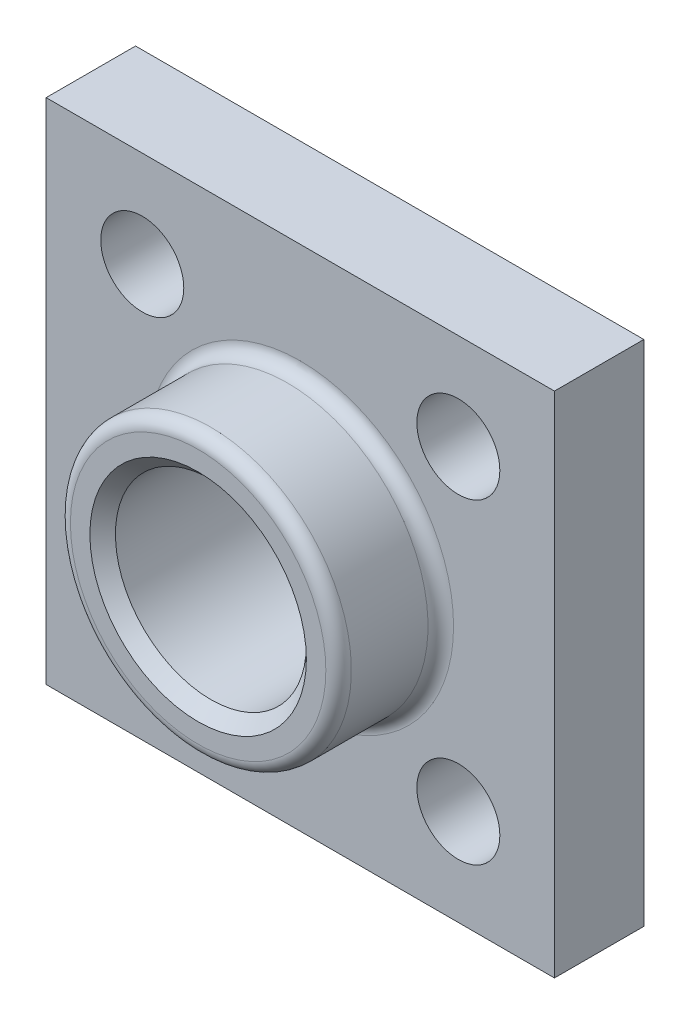
ISO-10303-21;
HEADER;
FILE_DESCRIPTION(('STEP AP214'),'2;1');
FILE_NAME('part.step','',(''),(''),'','','');
FILE_SCHEMA(('AUTOMOTIVE_DESIGN { 1 0 10303 214 1 1 1 1 }'));
ENDSEC;
DATA;
#1=APPLICATION_CONTEXT('core data for automotive mechanical design processes');
#2=APPLICATION_PROTOCOL_DEFINITION('international standard','automotive_design',2000,#1);
#3=PRODUCT_CONTEXT('',#1,'mechanical');
#4=PRODUCT('Part','Part','',(#3));
#5=PRODUCT_RELATED_PRODUCT_CATEGORY('part','',(#4));
#6=PRODUCT_DEFINITION_FORMATION('','',#4);
#7=PRODUCT_DEFINITION_CONTEXT('part definition',#1,'design');
#8=PRODUCT_DEFINITION('design','',#6,#7);
#9=PRODUCT_DEFINITION_SHAPE('','',#8);
#10=(LENGTH_UNIT() NAMED_UNIT(*) SI_UNIT(.MILLI.,.METRE.));
#11=(NAMED_UNIT(*) PLANE_ANGLE_UNIT() SI_UNIT($,.RADIAN.));
#12=(NAMED_UNIT(*) SI_UNIT($,.STERADIAN.) SOLID_ANGLE_UNIT());
#13=UNCERTAINTY_MEASURE_WITH_UNIT(LENGTH_MEASURE(1.E-05),#10,'distance_accuracy_value','');
#14=(GEOMETRIC_REPRESENTATION_CONTEXT(3) GLOBAL_UNCERTAINTY_ASSIGNED_CONTEXT((#13)) GLOBAL_UNIT_ASSIGNED_CONTEXT((#10,
#11,#12)) REPRESENTATION_CONTEXT('',''));
#15=CARTESIAN_POINT('',(0.,0.,0.));
#16=DIRECTION('',(0.,0.,1.));
#17=DIRECTION('',(1.,0.,0.));
#18=AXIS2_PLACEMENT_3D('',#15,#16,#17);
#19=CARTESIAN_POINT('',(19.9,-19.9,15.));
#20=DIRECTION('',(0.,0.,1.));
#21=DIRECTION('',(1.,0.,0.));
#22=AXIS2_PLACEMENT_3D('',#19,#20,#21);
#23=PLANE('',#22);
#24=CARTESIAN_POINT('',(19.9,-19.9,15.));
#25=DIRECTION('',(0.,0.,1.));
#26=DIRECTION('',(0.,-1.,0.));
#27=AXIS2_PLACEMENT_3D('',#24,#25,#26);
#28=CIRCLE('',#27,8.475);
#29=CARTESIAN_POINT('',(19.9,-28.375,15.));
#30=VERTEX_POINT('',#29);
#31=EDGE_CURVE('E74',#30,#30,#28,.T.);
#32=ORIENTED_EDGE('',*,*,#31,.F.);
#33=EDGE_LOOP('',(#32));
#34=FACE_BOUND('',#33,.T.);
#35=CARTESIAN_POINT('',(19.9,-19.9,15.));
#36=DIRECTION('',(0.,0.,-1.));
#37=DIRECTION('',(1.,0.,0.));
#38=AXIS2_PLACEMENT_3D('',#35,#36,#37);
#39=CIRCLE('',#38,10.);
#40=CARTESIAN_POINT('',(29.9,-19.9,15.));
#41=VERTEX_POINT('',#40);
#42=CARTESIAN_POINT('',(9.9,-19.9,15.));
#43=VERTEX_POINT('',#42);
#44=EDGE_CURVE('E68',#41,#43,#39,.T.);
#45=ORIENTED_EDGE('',*,*,#44,.F.);
#46=CARTESIAN_POINT('',(19.9,-19.9,15.));
#47=DIRECTION('',(0.,0.,-1.));
#48=DIRECTION('',(-1.,0.,0.));
#49=AXIS2_PLACEMENT_3D('',#46,#47,#48);
#50=CIRCLE('',#49,10.);
#51=EDGE_CURVE('E64',#43,#41,#50,.T.);
#52=ORIENTED_EDGE('',*,*,#51,.F.);
#53=EDGE_LOOP('',(#45,#52));
#54=FACE_BOUND('',#53,.T.);
#55=ADVANCED_FACE('F17',(#34,#54),#23,.T.);
#56=CARTESIAN_POINT('',(19.9,-19.9,14.));
#57=DIRECTION('',(0.,0.,-1.));
#58=DIRECTION('',(-1.,0.,0.));
#59=AXIS2_PLACEMENT_3D('',#56,#57,#58);
#60=TOROIDAL_SURFACE('',#59,10.,1.);
#61=CARTESIAN_POINT('',(19.9,-19.9,14.));
#62=DIRECTION('',(0.,0.,1.));
#63=DIRECTION('',(-1.,0.,0.));
#64=AXIS2_PLACEMENT_3D('',#61,#62,#63);
#65=CIRCLE('',#64,11.);
#66=CARTESIAN_POINT('',(8.9,-19.9,14.));
#67=VERTEX_POINT('',#66);
#68=EDGE_CURVE('E102',#67,#67,#65,.F.);
#69=ORIENTED_EDGE('',*,*,#68,.F.);
#70=EDGE_LOOP('',(#69));
#71=FACE_BOUND('',#70,.T.);
#72=ORIENTED_EDGE('',*,*,#44,.T.);
#73=ORIENTED_EDGE('',*,*,#51,.T.);
#74=EDGE_LOOP('',(#72,#73));
#75=FACE_BOUND('',#74,.T.);
#76=ADVANCED_FACE('F73',(#71,#75),#60,.T.);
#77=CARTESIAN_POINT('',(19.9,-19.9,14.));
#78=DIRECTION('',(0.,0.,1.));
#79=DIRECTION('',(0.,-1.,0.));
#80=AXIS2_PLACEMENT_3D('',#77,#78,#79);
#81=CONICAL_SURFACE('',#80,7.475,0.785398163397451);
#82=ORIENTED_EDGE('',*,*,#31,.T.);
#83=EDGE_LOOP('',(#82));
#84=FACE_BOUND('',#83,.T.);
#85=CARTESIAN_POINT('',(19.9,-19.9,14.));
#86=DIRECTION('',(0.,0.,1.));
#87=DIRECTION('',(1.,0.,0.));
#88=AXIS2_PLACEMENT_3D('',#85,#86,#87);
#89=CIRCLE('',#88,7.475);
#90=CARTESIAN_POINT('',(27.375,-19.9,14.));
#91=VERTEX_POINT('',#90);
#92=EDGE_CURVE('E100',#91,#91,#89,.T.);
#93=ORIENTED_EDGE('',*,*,#92,.F.);
#94=EDGE_LOOP('',(#93));
#95=FACE_BOUND('',#94,.T.);
#96=ADVANCED_FACE('F91',(#84,#95),#81,.F.);
#97=CARTESIAN_POINT('',(19.9,-19.9,8.));
#98=DIRECTION('',(0.,0.,1.));
#99=DIRECTION('',(1.,0.,0.));
#100=AXIS2_PLACEMENT_3D('',#97,#98,#99);
#101=CYLINDRICAL_SURFACE('',#100,11.);
#102=CARTESIAN_POINT('',(19.9,-19.9,8.));
#103=DIRECTION('',(0.,0.,-1.));
#104=DIRECTION('',(-1.,0.,0.));
#105=AXIS2_PLACEMENT_3D('',#102,#103,#104);
#106=CIRCLE('',#105,11.);
#107=CARTESIAN_POINT('',(8.89999999999999,-19.9,8.));
#108=VERTEX_POINT('',#107);
#109=EDGE_CURVE('E114',#108,#108,#106,.T.);
#110=ORIENTED_EDGE('',*,*,#109,.F.);
#111=EDGE_LOOP('',(#110));
#112=FACE_BOUND('',#111,.T.);
#113=ORIENTED_EDGE('',*,*,#68,.T.);
#114=EDGE_LOOP('',(#113));
#115=FACE_BOUND('',#114,.T.);
#116=ADVANCED_FACE('F190',(#112,#115),#101,.T.);
#117=CARTESIAN_POINT('',(19.9,-19.9,1.));
#118=DIRECTION('',(0.,0.,1.));
#119=DIRECTION('',(1.,0.,0.));
#120=AXIS2_PLACEMENT_3D('',#117,#118,#119);
#121=CYLINDRICAL_SURFACE('',#120,7.475);
#122=CARTESIAN_POINT('',(19.9,-19.9,0.999999999999996));
#123=DIRECTION('',(0.,0.,-1.));
#124=DIRECTION('',(1.,0.,0.));
#125=AXIS2_PLACEMENT_3D('',#122,#123,#124);
#126=CIRCLE('',#125,7.475);
#127=CARTESIAN_POINT('',(27.375,-19.9,0.999999999999996));
#128=VERTEX_POINT('',#127);
#129=EDGE_CURVE('E175',#128,#128,#126,.F.);
#130=ORIENTED_EDGE('',*,*,#129,.F.);
#131=EDGE_LOOP('',(#130));
#132=FACE_BOUND('',#131,.T.);
#133=ORIENTED_EDGE('',*,*,#92,.T.);
#134=EDGE_LOOP('',(#133));
#135=FACE_BOUND('',#134,.T.);
#136=ADVANCED_FACE('F192',(#132,#135),#121,.F.);
#137=CARTESIAN_POINT('',(19.9,-19.9,8.));
#138=DIRECTION('',(0.,0.,-1.));
#139=DIRECTION('',(-1.,0.,0.));
#140=AXIS2_PLACEMENT_3D('',#137,#138,#139);
#141=TOROIDAL_SURFACE('',#140,12.,1.);
#142=CARTESIAN_POINT('',(19.9,-19.9,7.));
#143=DIRECTION('',(0.,0.,-1.));
#144=DIRECTION('',(-1.,0.,0.));
#145=AXIS2_PLACEMENT_3D('',#142,#143,#144);
#146=CIRCLE('',#145,12.);
#147=CARTESIAN_POINT('',(7.9,-19.9,7.));
#148=VERTEX_POINT('',#147);
#149=EDGE_CURVE('E130',#148,#148,#146,.T.);
#150=ORIENTED_EDGE('',*,*,#149,.F.);
#151=EDGE_LOOP('',(#150));
#152=FACE_BOUND('',#151,.T.);
#153=ORIENTED_EDGE('',*,*,#109,.T.);
#154=EDGE_LOOP('',(#153));
#155=FACE_BOUND('',#154,.T.);
#156=ADVANCED_FACE('F188',(#152,#155),#141,.F.);
#157=CARTESIAN_POINT('',(0.,0.,0.));
#158=DIRECTION('',(0.,1.,0.));
#159=DIRECTION('',(0.,0.,1.));
#160=AXIS2_PLACEMENT_3D('',#157,#158,#159);
#161=PLANE('',#160);
#162=DIRECTION('',(-1.,0.,0.));
#163=VECTOR('',#162,1.);
#164=CARTESIAN_POINT('',(19.9,0.,0.));
#165=LINE('',#164,#163);
#166=CARTESIAN_POINT('',(0.,0.,0.));
#167=VERTEX_POINT('',#166);
#168=CARTESIAN_POINT('',(39.8,0.,0.));
#169=VERTEX_POINT('',#168);
#170=EDGE_CURVE('E133',#167,#169,#165,.F.);
#171=ORIENTED_EDGE('',*,*,#170,.F.);
#172=DIRECTION('',(0.,0.,1.));
#173=VECTOR('',#172,1.);
#174=CARTESIAN_POINT('',(0.,0.,0.));
#175=LINE('',#174,#173);
#176=CARTESIAN_POINT('',(0.,0.,7.));
#177=VERTEX_POINT('',#176);
#178=EDGE_CURVE('E177',#177,#167,#175,.F.);
#179=ORIENTED_EDGE('',*,*,#178,.F.);
#180=DIRECTION('',(1.,0.,0.));
#181=VECTOR('',#180,1.);
#182=CARTESIAN_POINT('',(19.9,0.,7.));
#183=LINE('',#182,#181);
#184=CARTESIAN_POINT('',(39.8,0.,7.));
#185=VERTEX_POINT('',#184);
#186=EDGE_CURVE('E165',#185,#177,#183,.F.);
#187=ORIENTED_EDGE('',*,*,#186,.F.);
#188=DIRECTION('',(0.,0.,-1.));
#189=VECTOR('',#188,1.);
#190=CARTESIAN_POINT('',(39.8,0.,0.));
#191=LINE('',#190,#189);
#192=EDGE_CURVE('E182',#169,#185,#191,.F.);
#193=ORIENTED_EDGE('',*,*,#192,.F.);
#194=EDGE_LOOP('',(#171,#179,#187,#193));
#195=FACE_BOUND('',#194,.T.);
#196=ADVANCED_FACE('F223',(#195),#161,.T.);
#197=CARTESIAN_POINT('',(39.8,0.,0.));
#198=DIRECTION('',(1.,0.,0.));
#199=DIRECTION('',(0.,0.,-1.));
#200=AXIS2_PLACEMENT_3D('',#197,#198,#199);
#201=PLANE('',#200);
#202=DIRECTION('',(0.,1.,0.));
#203=VECTOR('',#202,1.);
#204=CARTESIAN_POINT('',(39.8,-19.9,0.));
#205=LINE('',#204,#203);
#206=CARTESIAN_POINT('',(39.8,-39.8,0.));
#207=VERTEX_POINT('',#206);
#208=EDGE_CURVE('E237',#169,#207,#205,.F.);
#209=ORIENTED_EDGE('',*,*,#208,.F.);
#210=ORIENTED_EDGE('',*,*,#192,.T.);
#211=DIRECTION('',(0.,1.,0.));
#212=VECTOR('',#211,1.);
#213=CARTESIAN_POINT('',(39.8,-19.9,7.));
#214=LINE('',#213,#212);
#215=CARTESIAN_POINT('',(39.8,-39.8,7.));
#216=VERTEX_POINT('',#215);
#217=EDGE_CURVE('E170',#216,#185,#214,.T.);
#218=ORIENTED_EDGE('',*,*,#217,.F.);
#219=DIRECTION('',(0.,0.,-1.));
#220=VECTOR('',#219,1.);
#221=CARTESIAN_POINT('',(39.8,-39.8,0.));
#222=LINE('',#221,#220);
#223=EDGE_CURVE('E179',#207,#216,#222,.F.);
#224=ORIENTED_EDGE('',*,*,#223,.F.);
#225=EDGE_LOOP('',(#209,#210,#218,#224));
#226=FACE_BOUND('',#225,.T.);
#227=ADVANCED_FACE('F221',(#226),#201,.T.);
#228=CARTESIAN_POINT('',(39.8,-39.8,0.));
#229=DIRECTION('',(0.,-1.,0.));
#230=DIRECTION('',(0.,0.,-1.));
#231=AXIS2_PLACEMENT_3D('',#228,#229,#230);
#232=PLANE('',#231);
#233=DIRECTION('',(-1.,0.,0.));
#234=VECTOR('',#233,1.);
#235=CARTESIAN_POINT('',(19.9,-39.8,0.));
#236=LINE('',#235,#234);
#237=CARTESIAN_POINT('',(0.,-39.8,0.));
#238=VERTEX_POINT('',#237);
#239=EDGE_CURVE('E239',#207,#238,#236,.T.);
#240=ORIENTED_EDGE('',*,*,#239,.F.);
#241=ORIENTED_EDGE('',*,*,#223,.T.);
#242=DIRECTION('',(1.,0.,0.));
#243=VECTOR('',#242,1.);
#244=CARTESIAN_POINT('',(19.9,-39.8,7.));
#245=LINE('',#244,#243);
#246=CARTESIAN_POINT('',(0.,-39.8,7.));
#247=VERTEX_POINT('',#246);
#248=EDGE_CURVE('E124',#247,#216,#245,.T.);
#249=ORIENTED_EDGE('',*,*,#248,.F.);
#250=DIRECTION('',(0.,0.,1.));
#251=VECTOR('',#250,1.);
#252=CARTESIAN_POINT('',(0.,-39.8,0.));
#253=LINE('',#252,#251);
#254=EDGE_CURVE('E38',#238,#247,#253,.T.);
#255=ORIENTED_EDGE('',*,*,#254,.F.);
#256=EDGE_LOOP('',(#240,#241,#249,#255));
#257=FACE_BOUND('',#256,.T.);
#258=ADVANCED_FACE('F218',(#257),#232,.T.);
#259=CARTESIAN_POINT('',(0.,-39.8,0.));
#260=DIRECTION('',(-1.,0.,0.));
#261=DIRECTION('',(0.,0.,1.));
#262=AXIS2_PLACEMENT_3D('',#259,#260,#261);
#263=PLANE('',#262);
#264=DIRECTION('',(0.,1.,0.));
#265=VECTOR('',#264,1.);
#266=CARTESIAN_POINT('',(0.,-19.9,0.));
#267=LINE('',#266,#265);
#268=EDGE_CURVE('E138',#238,#167,#267,.T.);
#269=ORIENTED_EDGE('',*,*,#268,.F.);
#270=ORIENTED_EDGE('',*,*,#254,.T.);
#271=DIRECTION('',(0.,1.,0.));
#272=VECTOR('',#271,1.);
#273=CARTESIAN_POINT('',(0.,-19.9,7.));
#274=LINE('',#273,#272);
#275=EDGE_CURVE('E162',#177,#247,#274,.F.);
#276=ORIENTED_EDGE('',*,*,#275,.F.);
#277=ORIENTED_EDGE('',*,*,#178,.T.);
#278=EDGE_LOOP('',(#269,#270,#276,#277));
#279=FACE_BOUND('',#278,.T.);
#280=ADVANCED_FACE('F214',(#279),#263,.T.);
#281=CARTESIAN_POINT('',(32.2743686707646,-7.52563132923542,0.));
#282=DIRECTION('',(0.,0.,1.));
#283=DIRECTION('',(1.,0.,0.));
#284=AXIS2_PLACEMENT_3D('',#281,#282,#283);
#285=CYLINDRICAL_SURFACE('',#284,3.24999999999999);
#286=CARTESIAN_POINT('',(32.2743686707646,-7.52563132923542,7.));
#287=DIRECTION('',(0.,0.,1.));
#288=DIRECTION('',(1.,0.,0.));
#289=AXIS2_PLACEMENT_3D('',#286,#287,#288);
#290=CIRCLE('',#289,3.24999999999999);
#291=CARTESIAN_POINT('',(35.5243686707646,-7.52563132923542,7.));
#292=VERTEX_POINT('',#291);
#293=EDGE_CURVE('E120',#292,#292,#290,.F.);
#294=ORIENTED_EDGE('',*,*,#293,.F.);
#295=EDGE_LOOP('',(#294));
#296=FACE_BOUND('',#295,.T.);
#297=CARTESIAN_POINT('',(32.2743686707646,-7.52563132923542,0.));
#298=DIRECTION('',(0.,0.,1.));
#299=DIRECTION('',(1.,0.,0.));
#300=AXIS2_PLACEMENT_3D('',#297,#298,#299);
#301=CIRCLE('',#300,3.24999999999999);
#302=CARTESIAN_POINT('',(35.5243686707646,-7.52563132923542,0.));
#303=VERTEX_POINT('',#302);
#304=EDGE_CURVE('E134',#303,#303,#301,.T.);
#305=ORIENTED_EDGE('',*,*,#304,.F.);
#306=EDGE_LOOP('',(#305));
#307=FACE_BOUND('',#306,.T.);
#308=ADVANCED_FACE('F217',(#296,#307),#285,.F.);
#309=CARTESIAN_POINT('',(32.2743686707646,-32.2743686707646,0.));
#310=DIRECTION('',(0.,0.,1.));
#311=DIRECTION('',(1.,0.,0.));
#312=AXIS2_PLACEMENT_3D('',#309,#310,#311);
#313=CYLINDRICAL_SURFACE('',#312,3.25);
#314=CARTESIAN_POINT('',(32.2743686707646,-32.2743686707646,7.));
#315=DIRECTION('',(0.,0.,1.));
#316=DIRECTION('',(1.,0.,0.));
#317=AXIS2_PLACEMENT_3D('',#314,#315,#316);
#318=CIRCLE('',#317,3.25);
#319=CARTESIAN_POINT('',(35.5243686707646,-32.2743686707646,7.));
#320=VERTEX_POINT('',#319);
#321=EDGE_CURVE('E123',#320,#320,#318,.F.);
#322=ORIENTED_EDGE('',*,*,#321,.F.);
#323=EDGE_LOOP('',(#322));
#324=FACE_BOUND('',#323,.T.);
#325=CARTESIAN_POINT('',(32.2743686707646,-32.2743686707646,0.));
#326=DIRECTION('',(0.,0.,1.));
#327=DIRECTION('',(1.,0.,0.));
#328=AXIS2_PLACEMENT_3D('',#325,#326,#327);
#329=CIRCLE('',#328,3.25);
#330=CARTESIAN_POINT('',(35.5243686707646,-32.2743686707646,0.));
#331=VERTEX_POINT('',#330);
#332=EDGE_CURVE('E137',#331,#331,#329,.T.);
#333=ORIENTED_EDGE('',*,*,#332,.F.);
#334=EDGE_LOOP('',(#333));
#335=FACE_BOUND('',#334,.T.);
#336=ADVANCED_FACE('F249',(#324,#335),#313,.F.);
#337=CARTESIAN_POINT('',(7.52563132923542,-32.2743686707646,0.));
#338=DIRECTION('',(0.,0.,1.));
#339=DIRECTION('',(1.,0.,0.));
#340=AXIS2_PLACEMENT_3D('',#337,#338,#339);
#341=CYLINDRICAL_SURFACE('',#340,3.25);
#342=CARTESIAN_POINT('',(7.52563132923542,-32.2743686707646,7.));
#343=DIRECTION('',(0.,0.,1.));
#344=DIRECTION('',(1.,0.,0.));
#345=AXIS2_PLACEMENT_3D('',#342,#343,#344);
#346=CIRCLE('',#345,3.25);
#347=CARTESIAN_POINT('',(10.7756313292354,-32.2743686707646,7.));
#348=VERTEX_POINT('',#347);
#349=EDGE_CURVE('E127',#348,#348,#346,.F.);
#350=ORIENTED_EDGE('',*,*,#349,.F.);
#351=EDGE_LOOP('',(#350));
#352=FACE_BOUND('',#351,.T.);
#353=CARTESIAN_POINT('',(7.52563132923542,-32.2743686707646,0.));
#354=DIRECTION('',(0.,0.,1.));
#355=DIRECTION('',(1.,0.,0.));
#356=AXIS2_PLACEMENT_3D('',#353,#354,#355);
#357=CIRCLE('',#356,3.25);
#358=CARTESIAN_POINT('',(10.7756313292354,-32.2743686707646,0.));
#359=VERTEX_POINT('',#358);
#360=EDGE_CURVE('E141',#359,#359,#357,.T.);
#361=ORIENTED_EDGE('',*,*,#360,.F.);
#362=EDGE_LOOP('',(#361));
#363=FACE_BOUND('',#362,.T.);
#364=ADVANCED_FACE('F212',(#352,#363),#341,.F.);
#365=CARTESIAN_POINT('',(19.9,-19.9,0.999999999999996));
#366=DIRECTION('',(0.,0.,-1.));
#367=DIRECTION('',(-1.,0.,0.));
#368=AXIS2_PLACEMENT_3D('',#365,#366,#367);
#369=CONICAL_SURFACE('',#368,7.475,0.785398163397451);
#370=CARTESIAN_POINT('',(19.9,-19.9,0.));
#371=DIRECTION('',(0.,0.,-1.));
#372=DIRECTION('',(-1.,0.,0.));
#373=AXIS2_PLACEMENT_3D('',#370,#371,#372);
#374=CIRCLE('',#373,8.475);
#375=CARTESIAN_POINT('',(11.425,-19.9,0.));
#376=VERTEX_POINT('',#375);
#377=EDGE_CURVE('E144',#376,#376,#374,.F.);
#378=ORIENTED_EDGE('',*,*,#377,.F.);
#379=EDGE_LOOP('',(#378));
#380=FACE_BOUND('',#379,.T.);
#381=ORIENTED_EDGE('',*,*,#129,.T.);
#382=EDGE_LOOP('',(#381));
#383=FACE_BOUND('',#382,.T.);
#384=ADVANCED_FACE('F155',(#380,#383),#369,.F.);
#385=CARTESIAN_POINT('',(19.9,-19.9,7.));
#386=DIRECTION('',(0.,0.,1.));
#387=DIRECTION('',(1.,0.,0.));
#388=AXIS2_PLACEMENT_3D('',#385,#386,#387);
#389=PLANE('',#388);
#390=ORIENTED_EDGE('',*,*,#149,.T.);
#391=EDGE_LOOP('',(#390));
#392=FACE_BOUND('',#391,.T.);
#393=ORIENTED_EDGE('',*,*,#349,.T.);
#394=EDGE_LOOP('',(#393));
#395=FACE_BOUND('',#394,.T.);
#396=ORIENTED_EDGE('',*,*,#321,.T.);
#397=EDGE_LOOP('',(#396));
#398=FACE_BOUND('',#397,.T.);
#399=ORIENTED_EDGE('',*,*,#293,.T.);
#400=EDGE_LOOP('',(#399));
#401=FACE_BOUND('',#400,.T.);
#402=CARTESIAN_POINT('',(7.52563132923543,-7.52563132923543,7.));
#403=DIRECTION('',(0.,0.,1.));
#404=DIRECTION('',(1.,0.,0.));
#405=AXIS2_PLACEMENT_3D('',#402,#403,#404);
#406=CIRCLE('',#405,3.24999999999999);
#407=CARTESIAN_POINT('',(10.7756313292354,-7.52563132923543,7.));
#408=VERTEX_POINT('',#407);
#409=EDGE_CURVE('E29',#408,#408,#406,.T.);
#410=ORIENTED_EDGE('',*,*,#409,.F.);
#411=EDGE_LOOP('',(#410));
#412=FACE_BOUND('',#411,.T.);
#413=ORIENTED_EDGE('',*,*,#275,.T.);
#414=ORIENTED_EDGE('',*,*,#248,.T.);
#415=ORIENTED_EDGE('',*,*,#217,.T.);
#416=ORIENTED_EDGE('',*,*,#186,.T.);
#417=EDGE_LOOP('',(#413,#414,#415,#416));
#418=FACE_BOUND('',#417,.T.);
#419=ADVANCED_FACE('F151',(#392,#395,#398,#401,#412,#418),#389,.T.);
#420=CARTESIAN_POINT('',(19.9,-19.9,0.));
#421=DIRECTION('',(0.,0.,-1.));
#422=DIRECTION('',(-1.,0.,0.));
#423=AXIS2_PLACEMENT_3D('',#420,#421,#422);
#424=PLANE('',#423);
#425=ORIENTED_EDGE('',*,*,#377,.T.);
#426=EDGE_LOOP('',(#425));
#427=FACE_BOUND('',#426,.T.);
#428=ORIENTED_EDGE('',*,*,#360,.T.);
#429=EDGE_LOOP('',(#428));
#430=FACE_BOUND('',#429,.T.);
#431=ORIENTED_EDGE('',*,*,#332,.T.);
#432=EDGE_LOOP('',(#431));
#433=FACE_BOUND('',#432,.T.);
#434=ORIENTED_EDGE('',*,*,#304,.T.);
#435=EDGE_LOOP('',(#434));
#436=FACE_BOUND('',#435,.T.);
#437=CARTESIAN_POINT('',(7.52563132923543,-7.52563132923543,0.));
#438=DIRECTION('',(0.,0.,1.));
#439=DIRECTION('',(1.,0.,0.));
#440=AXIS2_PLACEMENT_3D('',#437,#438,#439);
#441=CIRCLE('',#440,3.24999999999999);
#442=CARTESIAN_POINT('',(10.7756313292354,-7.52563132923543,0.));
#443=VERTEX_POINT('',#442);
#444=EDGE_CURVE('E11',#443,#443,#441,.F.);
#445=ORIENTED_EDGE('',*,*,#444,.F.);
#446=EDGE_LOOP('',(#445));
#447=FACE_BOUND('',#446,.T.);
#448=ORIENTED_EDGE('',*,*,#239,.T.);
#449=ORIENTED_EDGE('',*,*,#268,.T.);
#450=ORIENTED_EDGE('',*,*,#170,.T.);
#451=ORIENTED_EDGE('',*,*,#208,.T.);
#452=EDGE_LOOP('',(#448,#449,#450,#451));
#453=FACE_BOUND('',#452,.T.);
#454=ADVANCED_FACE('F154',(#427,#430,#433,#436,#447,#453),#424,.T.);
#455=CARTESIAN_POINT('',(7.52563132923543,-7.52563132923543,0.));
#456=DIRECTION('',(0.,0.,1.));
#457=DIRECTION('',(1.,0.,0.));
#458=AXIS2_PLACEMENT_3D('',#455,#456,#457);
#459=CYLINDRICAL_SURFACE('',#458,3.24999999999999);
#460=ORIENTED_EDGE('',*,*,#409,.T.);
#461=EDGE_LOOP('',(#460));
#462=FACE_BOUND('',#461,.T.);
#463=ORIENTED_EDGE('',*,*,#444,.T.);
#464=EDGE_LOOP('',(#463));
#465=FACE_BOUND('',#464,.T.);
#466=ADVANCED_FACE('F19',(#462,#465),#459,.F.);
#467=CLOSED_SHELL('',(#55,#76,#96,#116,#136,#156,#196,#227,#258,#280,#308,#336,#364,#384,#419,
#454,#466));
#468=MANIFOLD_SOLID_BREP('B1',#467);
#469=ADVANCED_BREP_SHAPE_REPRESENTATION('',(#18,#468),#14);
#470=SHAPE_DEFINITION_REPRESENTATION(#9,#469);
ENDSEC;
END-ISO-10303-21;
